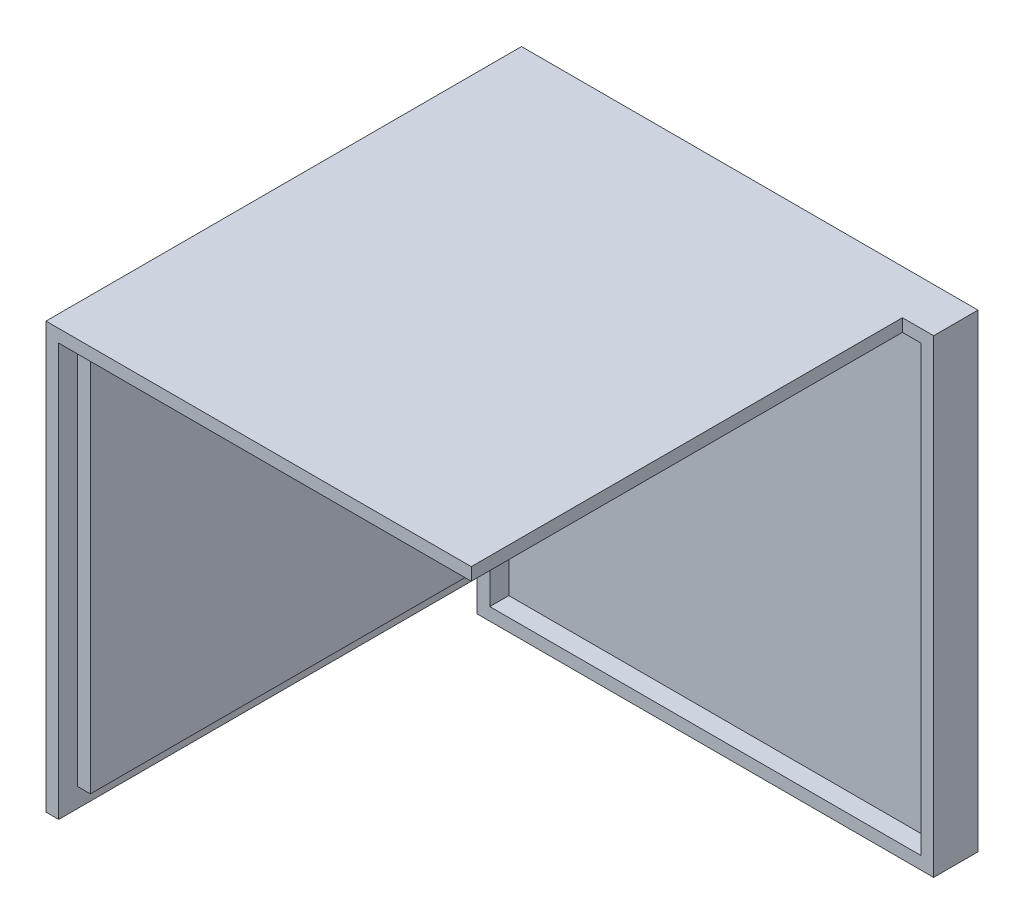
ISO-10303-21;
HEADER;
FILE_DESCRIPTION(('STEP AP214'),'2;1');
FILE_NAME('part.step','',(''),(''),'','','');
FILE_SCHEMA(('AUTOMOTIVE_DESIGN { 1 0 10303 214 1 1 1 1 }'));
ENDSEC;
DATA;
#1=APPLICATION_CONTEXT('core data for automotive mechanical design processes');
#2=APPLICATION_PROTOCOL_DEFINITION('international standard','automotive_design',2000,#1);
#3=PRODUCT_CONTEXT('',#1,'mechanical');
#4=PRODUCT('Part','Part','',(#3));
#5=PRODUCT_RELATED_PRODUCT_CATEGORY('part','',(#4));
#6=PRODUCT_DEFINITION_FORMATION('','',#4);
#7=PRODUCT_DEFINITION_CONTEXT('part definition',#1,'design');
#8=PRODUCT_DEFINITION('design','',#6,#7);
#9=PRODUCT_DEFINITION_SHAPE('','',#8);
#10=(LENGTH_UNIT() NAMED_UNIT(*) SI_UNIT(.MILLI.,.METRE.));
#11=(NAMED_UNIT(*) PLANE_ANGLE_UNIT() SI_UNIT($,.RADIAN.));
#12=(NAMED_UNIT(*) SI_UNIT($,.STERADIAN.) SOLID_ANGLE_UNIT());
#13=UNCERTAINTY_MEASURE_WITH_UNIT(LENGTH_MEASURE(1.E-05),#10,'distance_accuracy_value','');
#14=(GEOMETRIC_REPRESENTATION_CONTEXT(3) GLOBAL_UNCERTAINTY_ASSIGNED_CONTEXT((#13)) GLOBAL_UNIT_ASSIGNED_CONTEXT((#10,
#11,#12)) REPRESENTATION_CONTEXT('',''));
#15=CARTESIAN_POINT('',(0.,0.,0.));
#16=DIRECTION('',(0.,0.,1.));
#17=DIRECTION('',(1.,0.,0.));
#18=AXIS2_PLACEMENT_3D('',#15,#16,#17);
#19=CARTESIAN_POINT('',(0.,0.,0.));
#20=DIRECTION('',(0.,0.,-1.));
#21=DIRECTION('',(-1.,0.,0.));
#22=AXIS2_PLACEMENT_3D('',#19,#20,#21);
#23=PLANE('',#22);
#24=DIRECTION('',(-1.,0.,0.));
#25=VECTOR('',#24,1.);
#26=CARTESIAN_POINT('',(0.,16.6231215878365,0.));
#27=LINE('',#26,#25);
#28=CARTESIAN_POINT('',(-634.698083646895,16.6231215878382,0.));
#29=VERTEX_POINT('',#28);
#30=CARTESIAN_POINT('',(-639.698083646896,16.6231215878382,0.));
#31=VERTEX_POINT('',#30);
#32=EDGE_CURVE('E169',#29,#31,#27,.T.);
#33=ORIENTED_EDGE('',*,*,#32,.T.);
#34=DIRECTION('',(0.,-1.,0.));
#35=VECTOR('',#34,1.);
#36=CARTESIAN_POINT('',(-639.698083646896,0.,0.));
#37=LINE('',#36,#35);
#38=CARTESIAN_POINT('',(-639.698083646896,-3.17687841216174,0.));
#39=VERTEX_POINT('',#38);
#40=EDGE_CURVE('E239',#31,#39,#37,.T.);
#41=ORIENTED_EDGE('',*,*,#40,.T.);
#42=DIRECTION('',(-1.,0.,0.));
#43=VECTOR('',#42,1.);
#44=CARTESIAN_POINT('',(0.,-3.17687841216161,0.));
#45=LINE('',#44,#43);
#46=CARTESIAN_POINT('',(-469.698083646896,-3.17687841216171,0.));
#47=VERTEX_POINT('',#46);
#48=EDGE_CURVE('E242',#47,#39,#45,.T.);
#49=ORIENTED_EDGE('',*,*,#48,.F.);
#50=DIRECTION('',(0.,-1.,0.));
#51=VECTOR('',#50,1.);
#52=CARTESIAN_POINT('',(-469.698083646896,0.,0.));
#53=LINE('',#52,#51);
#54=CARTESIAN_POINT('',(-469.698083646896,171.823121587838,0.));
#55=VERTEX_POINT('',#54);
#56=EDGE_CURVE('E270',#55,#47,#53,.T.);
#57=ORIENTED_EDGE('',*,*,#56,.F.);
#58=DIRECTION('',(-1.,0.,0.));
#59=VECTOR('',#58,1.);
#60=CARTESIAN_POINT('',(0.,171.823121587838,0.));
#61=LINE('',#60,#59);
#62=CARTESIAN_POINT('',(-484.498083646896,171.823121587838,0.));
#63=VERTEX_POINT('',#62);
#64=EDGE_CURVE('E268',#55,#63,#61,.T.);
#65=ORIENTED_EDGE('',*,*,#64,.T.);
#66=DIRECTION('',(0.,-1.,0.));
#67=VECTOR('',#66,1.);
#68=CARTESIAN_POINT('',(-484.498083646896,0.,0.));
#69=LINE('',#68,#67);
#70=CARTESIAN_POINT('',(-484.498083646896,166.823121587838,0.));
#71=VERTEX_POINT('',#70);
#72=EDGE_CURVE('E207',#63,#71,#69,.T.);
#73=ORIENTED_EDGE('',*,*,#72,.T.);
#74=DIRECTION('',(-1.,0.,0.));
#75=VECTOR('',#74,1.);
#76=CARTESIAN_POINT('',(0.,166.823121587838,0.));
#77=LINE('',#76,#75);
#78=CARTESIAN_POINT('',(-634.698083646896,166.823121587838,0.));
#79=VERTEX_POINT('',#78);
#80=EDGE_CURVE('E61',#71,#79,#77,.T.);
#81=ORIENTED_EDGE('',*,*,#80,.T.);
#82=DIRECTION('',(0.,-1.,0.));
#83=VECTOR('',#82,1.);
#84=CARTESIAN_POINT('',(-634.698083646895,-4.40410266343904E-13,0.));
#85=LINE('',#84,#83);
#86=EDGE_CURVE('E56',#79,#29,#85,.T.);
#87=ORIENTED_EDGE('',*,*,#86,.T.);
#88=EDGE_LOOP('',(#33,#41,#49,#57,#65,#73,#81,#87));
#89=FACE_BOUND('',#88,.T.);
#90=ADVANCED_FACE('F41',(#89),#23,.F.);
#91=CARTESIAN_POINT('',(-464.698083646896,176.823121587838,-10.));
#92=DIRECTION('',(-1.,0.,0.));
#93=DIRECTION('',(0.,0.,1.));
#94=AXIS2_PLACEMENT_3D('',#91,#92,#93);
#95=PLANE('',#94);
#96=DIRECTION('',(0.,0.,1.));
#97=VECTOR('',#96,1.);
#98=CARTESIAN_POINT('',(-464.698083646896,176.823121587838,-10.));
#99=LINE('',#98,#97);
#100=CARTESIAN_POINT('',(-464.698083646896,176.823121587838,-10.));
#101=VERTEX_POINT('',#100);
#102=CARTESIAN_POINT('',(-464.698083646896,176.823121587838,7.5));
#103=VERTEX_POINT('',#102);
#104=EDGE_CURVE('E294',#101,#103,#99,.T.);
#105=ORIENTED_EDGE('',*,*,#104,.T.);
#106=DIRECTION('',(0.,-1.,0.));
#107=VECTOR('',#106,1.);
#108=CARTESIAN_POINT('',(-464.698083646896,0.,7.5));
#109=LINE('',#108,#107);
#110=CARTESIAN_POINT('',(-464.698083646896,-8.17687841216171,7.5));
#111=VERTEX_POINT('',#110);
#112=EDGE_CURVE('E250',#103,#111,#109,.T.);
#113=ORIENTED_EDGE('',*,*,#112,.T.);
#114=DIRECTION('',(0.,0.,1.));
#115=VECTOR('',#114,1.);
#116=CARTESIAN_POINT('',(-464.698083646896,-8.17687841216171,-10.));
#117=LINE('',#116,#115);
#118=CARTESIAN_POINT('',(-464.698083646896,-8.17687841216171,-10.));
#119=VERTEX_POINT('',#118);
#120=EDGE_CURVE('E11',#119,#111,#117,.T.);
#121=ORIENTED_EDGE('',*,*,#120,.F.);
#122=DIRECTION('',(0.,-1.,0.));
#123=VECTOR('',#122,1.);
#124=CARTESIAN_POINT('',(-464.698083646896,176.823121587838,-10.));
#125=LINE('',#124,#123);
#126=EDGE_CURVE('E283',#101,#119,#125,.T.);
#127=ORIENTED_EDGE('',*,*,#126,.F.);
#128=EDGE_LOOP('',(#105,#113,#121,#127));
#129=FACE_BOUND('',#128,.T.);
#130=ADVANCED_FACE('F43',(#129),#95,.F.);
#131=CARTESIAN_POINT('',(-464.698083646896,-8.17687841216171,-10.));
#132=DIRECTION('',(0.,1.,0.));
#133=DIRECTION('',(-1.,0.,0.));
#134=AXIS2_PLACEMENT_3D('',#131,#132,#133);
#135=PLANE('',#134);
#136=ORIENTED_EDGE('',*,*,#120,.T.);
#137=DIRECTION('',(-1.,0.,0.));
#138=VECTOR('',#137,1.);
#139=CARTESIAN_POINT('',(0.,-8.17687841216165,7.5));
#140=LINE('',#139,#138);
#141=CARTESIAN_POINT('',(-644.698083646895,-8.17687841216173,7.5));
#142=VERTEX_POINT('',#141);
#143=EDGE_CURVE('E247',#111,#142,#140,.T.);
#144=ORIENTED_EDGE('',*,*,#143,.T.);
#145=DIRECTION('',(0.,0.,1.));
#146=VECTOR('',#145,1.);
#147=CARTESIAN_POINT('',(-644.698083646895,-8.17687841216173,-10.));
#148=LINE('',#147,#146);
#149=CARTESIAN_POINT('',(-644.698083646895,-8.17687841216173,-10.));
#150=VERTEX_POINT('',#149);
#151=EDGE_CURVE('E49',#150,#142,#148,.T.);
#152=ORIENTED_EDGE('',*,*,#151,.F.);
#153=DIRECTION('',(-1.,0.,0.));
#154=VECTOR('',#153,1.);
#155=CARTESIAN_POINT('',(-464.698083646896,-8.17687841216171,-10.));
#156=LINE('',#155,#154);
#157=EDGE_CURVE('E286',#119,#150,#156,.T.);
#158=ORIENTED_EDGE('',*,*,#157,.F.);
#159=EDGE_LOOP('',(#136,#144,#152,#158));
#160=FACE_BOUND('',#159,.T.);
#161=ADVANCED_FACE('F307',(#160),#135,.F.);
#162=CARTESIAN_POINT('',(-644.698083646896,176.823121587838,-10.));
#163=DIRECTION('',(-1.,0.,0.));
#164=DIRECTION('',(0.,-1.,0.));
#165=AXIS2_PLACEMENT_3D('',#162,#163,#164);
#166=PLANE('',#165);
#167=DIRECTION('',(0.,-1.,0.));
#168=VECTOR('',#167,1.);
#169=CARTESIAN_POINT('',(-644.698083646895,-3.86896571025134E-13,177.5));
#170=LINE('',#169,#168);
#171=CARTESIAN_POINT('',(-644.698083646896,176.823121587838,177.5));
#172=VERTEX_POINT('',#171);
#173=CARTESIAN_POINT('',(-644.698083646895,9.12312158783827,177.5));
#174=VERTEX_POINT('',#173);
#175=EDGE_CURVE('E180',#172,#174,#170,.T.);
#176=ORIENTED_EDGE('',*,*,#175,.F.);
#177=DIRECTION('',(0.,0.,1.));
#178=VECTOR('',#177,1.);
#179=CARTESIAN_POINT('',(-644.698083646896,176.823121587838,-10.));
#180=LINE('',#179,#178);
#181=CARTESIAN_POINT('',(-644.698083646896,176.823121587838,-10.));
#182=VERTEX_POINT('',#181);
#183=EDGE_CURVE('E296',#182,#172,#180,.T.);
#184=ORIENTED_EDGE('',*,*,#183,.F.);
#185=DIRECTION('',(0.,-1.,0.));
#186=VECTOR('',#185,1.);
#187=CARTESIAN_POINT('',(-644.698083646896,176.823121587838,-10.));
#188=LINE('',#187,#186);
#189=EDGE_CURVE('E288',#182,#150,#188,.T.);
#190=ORIENTED_EDGE('',*,*,#189,.T.);
#191=ORIENTED_EDGE('',*,*,#151,.T.);
#192=DIRECTION('',(0.,-1.,0.));
#193=VECTOR('',#192,1.);
#194=CARTESIAN_POINT('',(-644.698083646895,-3.86896571025134E-13,7.5));
#195=LINE('',#194,#193);
#196=CARTESIAN_POINT('',(-644.698083646895,9.12312158783827,7.50000000000001));
#197=VERTEX_POINT('',#196);
#198=EDGE_CURVE('E244',#197,#142,#195,.T.);
#199=ORIENTED_EDGE('',*,*,#198,.F.);
#200=DIRECTION('',(0.,0.,-1.));
#201=VECTOR('',#200,1.);
#202=CARTESIAN_POINT('',(-644.698083646895,9.12312158783827,177.5));
#203=LINE('',#202,#201);
#204=EDGE_CURVE('E195',#174,#197,#203,.T.);
#205=ORIENTED_EDGE('',*,*,#204,.F.);
#206=EDGE_LOOP('',(#176,#184,#190,#191,#199,#205));
#207=FACE_BOUND('',#206,.T.);
#208=ADVANCED_FACE('F300',(#207),#166,.T.);
#209=CARTESIAN_POINT('',(-464.698083646896,176.823121587838,-10.));
#210=DIRECTION('',(0.,1.,0.));
#211=DIRECTION('',(-1.,0.,0.));
#212=AXIS2_PLACEMENT_3D('',#209,#210,#211);
#213=PLANE('',#212);
#214=ORIENTED_EDGE('',*,*,#183,.T.);
#215=DIRECTION('',(-1.,0.,0.));
#216=VECTOR('',#215,1.);
#217=CARTESIAN_POINT('',(0.,176.823121587838,177.5));
#218=LINE('',#217,#216);
#219=CARTESIAN_POINT('',(-476.998083646896,176.823121587838,177.5));
#220=VERTEX_POINT('',#219);
#221=EDGE_CURVE('E192',#220,#172,#218,.T.);
#222=ORIENTED_EDGE('',*,*,#221,.F.);
#223=DIRECTION('',(0.,0.,-1.));
#224=VECTOR('',#223,1.);
#225=CARTESIAN_POINT('',(-476.998083646896,176.823121587838,177.5));
#226=LINE('',#225,#224);
#227=CARTESIAN_POINT('',(-476.998083646896,176.823121587838,7.50000000000001));
#228=VERTEX_POINT('',#227);
#229=EDGE_CURVE('E197',#220,#228,#226,.T.);
#230=ORIENTED_EDGE('',*,*,#229,.T.);
#231=DIRECTION('',(-1.,0.,0.));
#232=VECTOR('',#231,1.);
#233=CARTESIAN_POINT('',(0.,176.823121587838,7.5));
#234=LINE('',#233,#232);
#235=EDGE_CURVE('E253',#103,#228,#234,.T.);
#236=ORIENTED_EDGE('',*,*,#235,.F.);
#237=ORIENTED_EDGE('',*,*,#104,.F.);
#238=DIRECTION('',(-1.,0.,0.));
#239=VECTOR('',#238,1.);
#240=CARTESIAN_POINT('',(-464.698083646896,176.823121587838,-10.));
#241=LINE('',#240,#239);
#242=EDGE_CURVE('E291',#101,#182,#241,.T.);
#243=ORIENTED_EDGE('',*,*,#242,.T.);
#244=EDGE_LOOP('',(#214,#222,#230,#236,#237,#243));
#245=FACE_BOUND('',#244,.T.);
#246=ADVANCED_FACE('F315',(#245),#213,.T.);
#247=CARTESIAN_POINT('',(0.,0.,-10.));
#248=DIRECTION('',(0.,0.,-1.));
#249=DIRECTION('',(-1.,0.,0.));
#250=AXIS2_PLACEMENT_3D('',#247,#248,#249);
#251=PLANE('',#250);
#252=ORIENTED_EDGE('',*,*,#126,.T.);
#253=ORIENTED_EDGE('',*,*,#157,.T.);
#254=ORIENTED_EDGE('',*,*,#189,.F.);
#255=ORIENTED_EDGE('',*,*,#242,.F.);
#256=EDGE_LOOP('',(#252,#253,#254,#255));
#257=FACE_BOUND('',#256,.T.);
#258=ADVANCED_FACE('F324',(#257),#251,.T.);
#259=CARTESIAN_POINT('',(-639.698083646896,0.,7.5));
#260=DIRECTION('',(1.,0.,0.));
#261=DIRECTION('',(0.,0.,-1.));
#262=AXIS2_PLACEMENT_3D('',#259,#260,#261);
#263=PLANE('',#262);
#264=ORIENTED_EDGE('',*,*,#40,.F.);
#265=DIRECTION('',(0.,0.,-1.));
#266=VECTOR('',#265,1.);
#267=CARTESIAN_POINT('',(-639.698083646896,16.6231215878382,170.));
#268=LINE('',#267,#266);
#269=CARTESIAN_POINT('',(-639.698083646896,16.6231215878382,170.));
#270=VERTEX_POINT('',#269);
#271=EDGE_CURVE('E222',#270,#31,#268,.T.);
#272=ORIENTED_EDGE('',*,*,#271,.F.);
#273=DIRECTION('',(0.,-1.,0.));
#274=VECTOR('',#273,1.);
#275=CARTESIAN_POINT('',(-639.698083646896,0.,170.));
#276=LINE('',#275,#274);
#277=CARTESIAN_POINT('',(-639.698083646896,171.823121587838,170.));
#278=VERTEX_POINT('',#277);
#279=EDGE_CURVE('E219',#278,#270,#276,.T.);
#280=ORIENTED_EDGE('',*,*,#279,.F.);
#281=DIRECTION('',(0.,0.,-1.));
#282=VECTOR('',#281,1.);
#283=CARTESIAN_POINT('',(-639.698083646896,171.823121587838,177.5));
#284=LINE('',#283,#282);
#285=CARTESIAN_POINT('',(-639.698083646896,171.823121587838,177.5));
#286=VERTEX_POINT('',#285);
#287=EDGE_CURVE('E170',#286,#278,#284,.T.);
#288=ORIENTED_EDGE('',*,*,#287,.F.);
#289=DIRECTION('',(0.,-1.,0.));
#290=VECTOR('',#289,1.);
#291=CARTESIAN_POINT('',(-639.698083646896,0.,177.5));
#292=LINE('',#291,#290);
#293=CARTESIAN_POINT('',(-639.698083646896,9.12312158783827,177.5));
#294=VERTEX_POINT('',#293);
#295=EDGE_CURVE('E176',#286,#294,#292,.T.);
#296=ORIENTED_EDGE('',*,*,#295,.T.);
#297=DIRECTION('',(0.,0.,-1.));
#298=VECTOR('',#297,1.);
#299=CARTESIAN_POINT('',(-639.698083646896,9.12312158783827,177.5));
#300=LINE('',#299,#298);
#301=CARTESIAN_POINT('',(-639.698083646896,9.12312158783827,7.50000000000001));
#302=VERTEX_POINT('',#301);
#303=EDGE_CURVE('E159',#294,#302,#300,.T.);
#304=ORIENTED_EDGE('',*,*,#303,.T.);
#305=DIRECTION('',(0.,-1.,0.));
#306=VECTOR('',#305,1.);
#307=CARTESIAN_POINT('',(-639.698083646896,0.,7.5));
#308=LINE('',#307,#306);
#309=CARTESIAN_POINT('',(-639.698083646896,-3.17687841216174,7.5));
#310=VERTEX_POINT('',#309);
#311=EDGE_CURVE('E240',#302,#310,#308,.T.);
#312=ORIENTED_EDGE('',*,*,#311,.T.);
#313=DIRECTION('',(0.,0.,-1.));
#314=VECTOR('',#313,1.);
#315=CARTESIAN_POINT('',(-639.698083646896,-3.17687841216174,7.5));
#316=LINE('',#315,#314);
#317=EDGE_CURVE('E266',#310,#39,#316,.T.);
#318=ORIENTED_EDGE('',*,*,#317,.T.);
#319=EDGE_LOOP('',(#264,#272,#280,#288,#296,#304,#312,#318));
#320=FACE_BOUND('',#319,.T.);
#321=ADVANCED_FACE('F183',(#320),#263,.T.);
#322=CARTESIAN_POINT('',(0.,171.823121587838,7.5));
#323=DIRECTION('',(0.,-1.,0.));
#324=DIRECTION('',(1.,0.,0.));
#325=AXIS2_PLACEMENT_3D('',#322,#323,#324);
#326=PLANE('',#325);
#327=ORIENTED_EDGE('',*,*,#64,.F.);
#328=DIRECTION('',(0.,0.,-1.));
#329=VECTOR('',#328,1.);
#330=CARTESIAN_POINT('',(-469.698083646896,171.823121587838,7.5));
#331=LINE('',#330,#329);
#332=CARTESIAN_POINT('',(-469.698083646896,171.823121587838,7.5));
#333=VERTEX_POINT('',#332);
#334=EDGE_CURVE('E280',#333,#55,#331,.T.);
#335=ORIENTED_EDGE('',*,*,#334,.F.);
#336=DIRECTION('',(-1.,0.,0.));
#337=VECTOR('',#336,1.);
#338=CARTESIAN_POINT('',(0.,171.823121587838,7.5));
#339=LINE('',#338,#337);
#340=CARTESIAN_POINT('',(-476.998083646896,171.823121587838,7.50000000000001));
#341=VERTEX_POINT('',#340);
#342=EDGE_CURVE('E259',#333,#341,#339,.T.);
#343=ORIENTED_EDGE('',*,*,#342,.T.);
#344=DIRECTION('',(0.,0.,-1.));
#345=VECTOR('',#344,1.);
#346=CARTESIAN_POINT('',(-476.998083646896,171.823121587838,177.5));
#347=LINE('',#346,#345);
#348=CARTESIAN_POINT('',(-476.998083646896,171.823121587838,177.5));
#349=VERTEX_POINT('',#348);
#350=EDGE_CURVE('E200',#349,#341,#347,.T.);
#351=ORIENTED_EDGE('',*,*,#350,.F.);
#352=DIRECTION('',(-1.,0.,0.));
#353=VECTOR('',#352,1.);
#354=CARTESIAN_POINT('',(0.,171.823121587838,177.5));
#355=LINE('',#354,#353);
#356=EDGE_CURVE('E185',#349,#286,#355,.T.);
#357=ORIENTED_EDGE('',*,*,#356,.T.);
#358=ORIENTED_EDGE('',*,*,#287,.T.);
#359=DIRECTION('',(-1.,0.,0.));
#360=VECTOR('',#359,1.);
#361=CARTESIAN_POINT('',(0.,171.823121587838,170.));
#362=LINE('',#361,#360);
#363=CARTESIAN_POINT('',(-484.498083646896,171.823121587838,170.));
#364=VERTEX_POINT('',#363);
#365=EDGE_CURVE('E216',#364,#278,#362,.T.);
#366=ORIENTED_EDGE('',*,*,#365,.F.);
#367=DIRECTION('',(0.,0.,-1.));
#368=VECTOR('',#367,1.);
#369=CARTESIAN_POINT('',(-484.498083646896,171.823121587838,170.));
#370=LINE('',#369,#368);
#371=EDGE_CURVE('E229',#364,#63,#370,.T.);
#372=ORIENTED_EDGE('',*,*,#371,.T.);
#373=EDGE_LOOP('',(#327,#335,#343,#351,#357,#358,#366,#372));
#374=FACE_BOUND('',#373,.T.);
#375=ADVANCED_FACE('F322',(#374),#326,.T.);
#376=CARTESIAN_POINT('',(-469.698083646896,0.,7.5));
#377=DIRECTION('',(1.,0.,0.));
#378=DIRECTION('',(0.,0.,-1.));
#379=AXIS2_PLACEMENT_3D('',#376,#377,#378);
#380=PLANE('',#379);
#381=ORIENTED_EDGE('',*,*,#56,.T.);
#382=DIRECTION('',(0.,0.,-1.));
#383=VECTOR('',#382,1.);
#384=CARTESIAN_POINT('',(-469.698083646896,-3.17687841216171,7.5));
#385=LINE('',#384,#383);
#386=CARTESIAN_POINT('',(-469.698083646896,-3.17687841216171,7.5));
#387=VERTEX_POINT('',#386);
#388=EDGE_CURVE('E277',#387,#47,#385,.T.);
#389=ORIENTED_EDGE('',*,*,#388,.F.);
#390=DIRECTION('',(0.,-1.,0.));
#391=VECTOR('',#390,1.);
#392=CARTESIAN_POINT('',(-469.698083646896,0.,7.5));
#393=LINE('',#392,#391);
#394=EDGE_CURVE('E262',#333,#387,#393,.T.);
#395=ORIENTED_EDGE('',*,*,#394,.F.);
#396=ORIENTED_EDGE('',*,*,#334,.T.);
#397=EDGE_LOOP('',(#381,#389,#395,#396));
#398=FACE_BOUND('',#397,.T.);
#399=ADVANCED_FACE('F371',(#398),#380,.F.);
#400=CARTESIAN_POINT('',(0.,-3.17687841216161,7.5));
#401=DIRECTION('',(0.,-1.,0.));
#402=DIRECTION('',(1.,0.,0.));
#403=AXIS2_PLACEMENT_3D('',#400,#401,#402);
#404=PLANE('',#403);
#405=ORIENTED_EDGE('',*,*,#48,.T.);
#406=ORIENTED_EDGE('',*,*,#317,.F.);
#407=DIRECTION('',(-1.,0.,0.));
#408=VECTOR('',#407,1.);
#409=CARTESIAN_POINT('',(0.,-3.17687841216161,7.5));
#410=LINE('',#409,#408);
#411=EDGE_CURVE('E264',#387,#310,#410,.T.);
#412=ORIENTED_EDGE('',*,*,#411,.F.);
#413=ORIENTED_EDGE('',*,*,#388,.T.);
#414=EDGE_LOOP('',(#405,#406,#412,#413));
#415=FACE_BOUND('',#414,.T.);
#416=ADVANCED_FACE('F384',(#415),#404,.F.);
#417=CARTESIAN_POINT('',(0.,0.,7.5));
#418=DIRECTION('',(0.,0.,1.));
#419=DIRECTION('',(1.,0.,0.));
#420=AXIS2_PLACEMENT_3D('',#417,#418,#419);
#421=PLANE('',#420);
#422=ORIENTED_EDGE('',*,*,#311,.F.);
#423=DIRECTION('',(-1.,0.,0.));
#424=VECTOR('',#423,1.);
#425=CARTESIAN_POINT('',(0.,9.12312158783737,7.5));
#426=LINE('',#425,#424);
#427=EDGE_CURVE('E164',#302,#197,#426,.T.);
#428=ORIENTED_EDGE('',*,*,#427,.T.);
#429=ORIENTED_EDGE('',*,*,#198,.T.);
#430=ORIENTED_EDGE('',*,*,#143,.F.);
#431=ORIENTED_EDGE('',*,*,#112,.F.);
#432=ORIENTED_EDGE('',*,*,#235,.T.);
#433=DIRECTION('',(0.,-1.,0.));
#434=VECTOR('',#433,1.);
#435=CARTESIAN_POINT('',(-476.998083646896,0.,7.5));
#436=LINE('',#435,#434);
#437=EDGE_CURVE('E256',#228,#341,#436,.T.);
#438=ORIENTED_EDGE('',*,*,#437,.T.);
#439=ORIENTED_EDGE('',*,*,#342,.F.);
#440=ORIENTED_EDGE('',*,*,#394,.T.);
#441=ORIENTED_EDGE('',*,*,#411,.T.);
#442=EDGE_LOOP('',(#422,#428,#429,#430,#431,#432,#438,#439,#440,#441));
#443=FACE_BOUND('',#442,.T.);
#444=ADVANCED_FACE('F305',(#443),#421,.T.);
#445=CARTESIAN_POINT('',(0.,16.6231215878365,170.));
#446=DIRECTION('',(0.,-1.,0.));
#447=DIRECTION('',(1.,0.,0.));
#448=AXIS2_PLACEMENT_3D('',#445,#446,#447);
#449=PLANE('',#448);
#450=ORIENTED_EDGE('',*,*,#32,.F.);
#451=DIRECTION('',(0.,0.,-1.));
#452=VECTOR('',#451,1.);
#453=CARTESIAN_POINT('',(-634.698083646895,16.6231215878382,170.));
#454=LINE('',#453,#452);
#455=CARTESIAN_POINT('',(-634.698083646895,16.6231215878382,170.));
#456=VERTEX_POINT('',#455);
#457=EDGE_CURVE('E237',#456,#29,#454,.T.);
#458=ORIENTED_EDGE('',*,*,#457,.F.);
#459=DIRECTION('',(-1.,0.,0.));
#460=VECTOR('',#459,1.);
#461=CARTESIAN_POINT('',(0.,16.6231215878365,170.));
#462=LINE('',#461,#460);
#463=EDGE_CURVE('E203',#456,#270,#462,.T.);
#464=ORIENTED_EDGE('',*,*,#463,.T.);
#465=ORIENTED_EDGE('',*,*,#271,.T.);
#466=EDGE_LOOP('',(#450,#458,#464,#465));
#467=FACE_BOUND('',#466,.T.);
#468=ADVANCED_FACE('F383',(#467),#449,.T.);
#469=CARTESIAN_POINT('',(-634.698083646895,-4.40410266343904E-13,170.));
#470=DIRECTION('',(1.,0.,0.));
#471=DIRECTION('',(0.,1.,0.));
#472=AXIS2_PLACEMENT_3D('',#469,#470,#471);
#473=PLANE('',#472);
#474=ORIENTED_EDGE('',*,*,#86,.F.);
#475=DIRECTION('',(0.,0.,-1.));
#476=VECTOR('',#475,1.);
#477=CARTESIAN_POINT('',(-634.698083646896,166.823121587838,170.));
#478=LINE('',#477,#476);
#479=CARTESIAN_POINT('',(-634.698083646896,166.823121587838,170.));
#480=VERTEX_POINT('',#479);
#481=EDGE_CURVE('E235',#480,#79,#478,.T.);
#482=ORIENTED_EDGE('',*,*,#481,.F.);
#483=DIRECTION('',(0.,-1.,0.));
#484=VECTOR('',#483,1.);
#485=CARTESIAN_POINT('',(-634.698083646895,-4.40410266343904E-13,170.));
#486=LINE('',#485,#484);
#487=EDGE_CURVE('E206',#480,#456,#486,.T.);
#488=ORIENTED_EDGE('',*,*,#487,.T.);
#489=ORIENTED_EDGE('',*,*,#457,.T.);
#490=EDGE_LOOP('',(#474,#482,#488,#489));
#491=FACE_BOUND('',#490,.T.);
#492=ADVANCED_FACE('F395',(#491),#473,.T.);
#493=CARTESIAN_POINT('',(0.,166.823121587838,170.));
#494=DIRECTION('',(0.,-1.,0.));
#495=DIRECTION('',(1.,0.,0.));
#496=AXIS2_PLACEMENT_3D('',#493,#494,#495);
#497=PLANE('',#496);
#498=ORIENTED_EDGE('',*,*,#80,.F.);
#499=DIRECTION('',(0.,0.,-1.));
#500=VECTOR('',#499,1.);
#501=CARTESIAN_POINT('',(-484.498083646896,166.823121587838,170.));
#502=LINE('',#501,#500);
#503=CARTESIAN_POINT('',(-484.498083646896,166.823121587838,170.));
#504=VERTEX_POINT('',#503);
#505=EDGE_CURVE('E232',#504,#71,#502,.T.);
#506=ORIENTED_EDGE('',*,*,#505,.F.);
#507=DIRECTION('',(-1.,0.,0.));
#508=VECTOR('',#507,1.);
#509=CARTESIAN_POINT('',(0.,166.823121587838,170.));
#510=LINE('',#509,#508);
#511=EDGE_CURVE('E210',#504,#480,#510,.T.);
#512=ORIENTED_EDGE('',*,*,#511,.T.);
#513=ORIENTED_EDGE('',*,*,#481,.T.);
#514=EDGE_LOOP('',(#498,#506,#512,#513));
#515=FACE_BOUND('',#514,.T.);
#516=ADVANCED_FACE('F409',(#515),#497,.T.);
#517=CARTESIAN_POINT('',(-484.498083646896,0.,170.));
#518=DIRECTION('',(1.,0.,0.));
#519=DIRECTION('',(0.,0.,-1.));
#520=AXIS2_PLACEMENT_3D('',#517,#518,#519);
#521=PLANE('',#520);
#522=ORIENTED_EDGE('',*,*,#72,.F.);
#523=ORIENTED_EDGE('',*,*,#371,.F.);
#524=DIRECTION('',(0.,-1.,0.));
#525=VECTOR('',#524,1.);
#526=CARTESIAN_POINT('',(-484.498083646896,0.,170.));
#527=LINE('',#526,#525);
#528=EDGE_CURVE('E213',#364,#504,#527,.T.);
#529=ORIENTED_EDGE('',*,*,#528,.T.);
#530=ORIENTED_EDGE('',*,*,#505,.T.);
#531=EDGE_LOOP('',(#522,#523,#529,#530));
#532=FACE_BOUND('',#531,.T.);
#533=ADVANCED_FACE('F403',(#532),#521,.T.);
#534=CARTESIAN_POINT('',(0.,0.,170.));
#535=DIRECTION('',(0.,0.,1.));
#536=DIRECTION('',(1.,0.,0.));
#537=AXIS2_PLACEMENT_3D('',#534,#535,#536);
#538=PLANE('',#537);
#539=ORIENTED_EDGE('',*,*,#463,.F.);
#540=ORIENTED_EDGE('',*,*,#487,.F.);
#541=ORIENTED_EDGE('',*,*,#511,.F.);
#542=ORIENTED_EDGE('',*,*,#528,.F.);
#543=ORIENTED_EDGE('',*,*,#365,.T.);
#544=ORIENTED_EDGE('',*,*,#279,.T.);
#545=EDGE_LOOP('',(#539,#540,#541,#542,#543,#544));
#546=FACE_BOUND('',#545,.T.);
#547=ADVANCED_FACE('F408',(#546),#538,.T.);
#548=CARTESIAN_POINT('',(0.,9.12312158783737,177.5));
#549=DIRECTION('',(0.,-1.,0.));
#550=DIRECTION('',(1.,0.,0.));
#551=AXIS2_PLACEMENT_3D('',#548,#549,#550);
#552=PLANE('',#551);
#553=ORIENTED_EDGE('',*,*,#204,.T.);
#554=ORIENTED_EDGE('',*,*,#427,.F.);
#555=ORIENTED_EDGE('',*,*,#303,.F.);
#556=DIRECTION('',(-1.,0.,0.));
#557=VECTOR('',#556,1.);
#558=CARTESIAN_POINT('',(0.,9.12312158783737,177.5));
#559=LINE('',#558,#557);
#560=EDGE_CURVE('E162',#294,#174,#559,.T.);
#561=ORIENTED_EDGE('',*,*,#560,.T.);
#562=EDGE_LOOP('',(#553,#554,#555,#561));
#563=FACE_BOUND('',#562,.T.);
#564=ADVANCED_FACE('F161',(#563),#552,.T.);
#565=CARTESIAN_POINT('',(-476.998083646896,0.,177.5));
#566=DIRECTION('',(1.,0.,0.));
#567=DIRECTION('',(0.,0.,-1.));
#568=AXIS2_PLACEMENT_3D('',#565,#566,#567);
#569=PLANE('',#568);
#570=ORIENTED_EDGE('',*,*,#350,.T.);
#571=ORIENTED_EDGE('',*,*,#437,.F.);
#572=ORIENTED_EDGE('',*,*,#229,.F.);
#573=DIRECTION('',(0.,-1.,0.));
#574=VECTOR('',#573,1.);
#575=CARTESIAN_POINT('',(-476.998083646896,0.,177.5));
#576=LINE('',#575,#574);
#577=EDGE_CURVE('E187',#220,#349,#576,.T.);
#578=ORIENTED_EDGE('',*,*,#577,.T.);
#579=EDGE_LOOP('',(#570,#571,#572,#578));
#580=FACE_BOUND('',#579,.T.);
#581=ADVANCED_FACE('F319',(#580),#569,.T.);
#582=CARTESIAN_POINT('',(0.,0.,177.5));
#583=DIRECTION('',(0.,0.,1.));
#584=DIRECTION('',(1.,0.,0.));
#585=AXIS2_PLACEMENT_3D('',#582,#583,#584);
#586=PLANE('',#585);
#587=ORIENTED_EDGE('',*,*,#560,.F.);
#588=ORIENTED_EDGE('',*,*,#295,.F.);
#589=ORIENTED_EDGE('',*,*,#356,.F.);
#590=ORIENTED_EDGE('',*,*,#577,.F.);
#591=ORIENTED_EDGE('',*,*,#221,.T.);
#592=ORIENTED_EDGE('',*,*,#175,.T.);
#593=EDGE_LOOP('',(#587,#588,#589,#590,#591,#592));
#594=FACE_BOUND('',#593,.T.);
#595=ADVANCED_FACE('F174',(#594),#586,.T.);
#596=CLOSED_SHELL('',(#90,#130,#161,#208,#246,#258,#321,#375,#399,#416,#444,#468,#492,#516,#533,
#547,#564,#581,#595));
#597=MANIFOLD_SOLID_BREP('B2',#596);
#598=ADVANCED_BREP_SHAPE_REPRESENTATION('',(#18,#597),#14);
#599=SHAPE_DEFINITION_REPRESENTATION(#9,#598);
ENDSEC;
END-ISO-10303-21;
